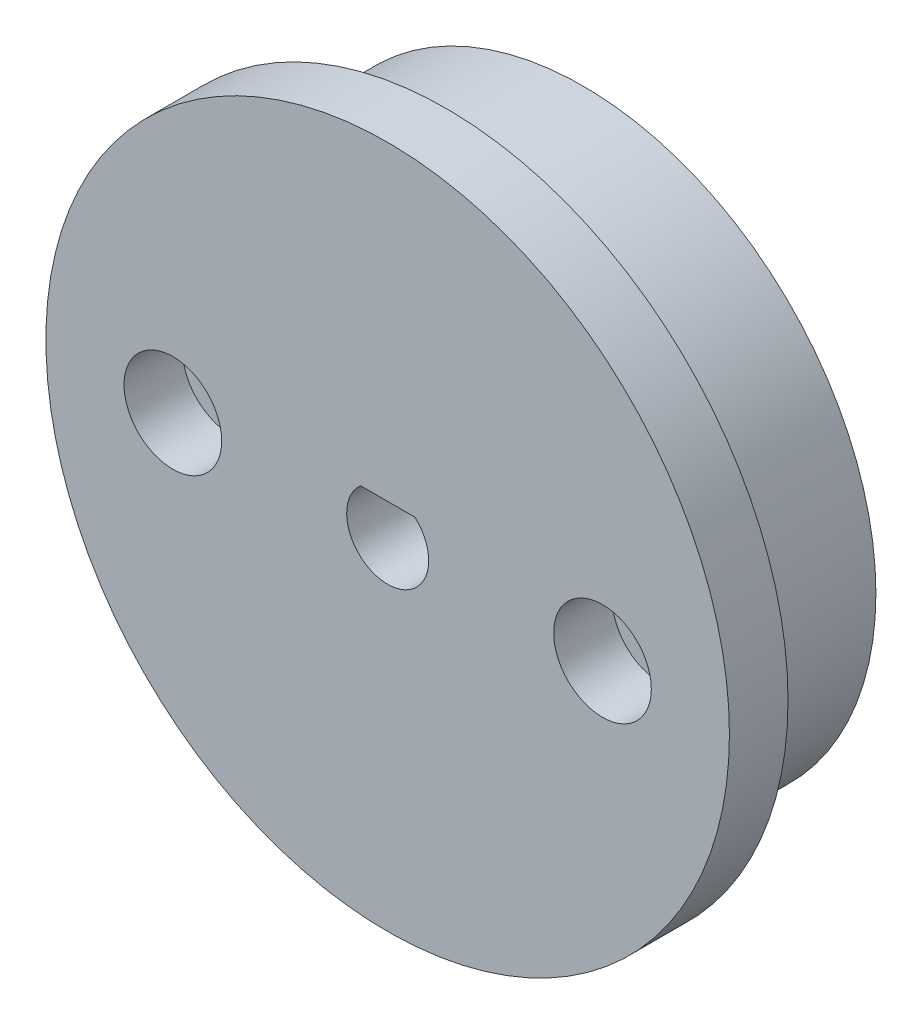
ISO-10303-21;
HEADER;
FILE_DESCRIPTION(('STEP AP214'),'2;1');
FILE_NAME('part.step','',(''),(''),'','','');
FILE_SCHEMA(('AUTOMOTIVE_DESIGN { 1 0 10303 214 1 1 1 1 }'));
ENDSEC;
DATA;
#1=APPLICATION_CONTEXT('core data for automotive mechanical design processes');
#2=APPLICATION_PROTOCOL_DEFINITION('international standard','automotive_design',2000,#1);
#3=PRODUCT_CONTEXT('',#1,'mechanical');
#4=PRODUCT('Part','Part','',(#3));
#5=PRODUCT_RELATED_PRODUCT_CATEGORY('part','',(#4));
#6=PRODUCT_DEFINITION_FORMATION('','',#4);
#7=PRODUCT_DEFINITION_CONTEXT('part definition',#1,'design');
#8=PRODUCT_DEFINITION('design','',#6,#7);
#9=PRODUCT_DEFINITION_SHAPE('','',#8);
#10=(LENGTH_UNIT() NAMED_UNIT(*) SI_UNIT(.MILLI.,.METRE.));
#11=(NAMED_UNIT(*) PLANE_ANGLE_UNIT() SI_UNIT($,.RADIAN.));
#12=(NAMED_UNIT(*) SI_UNIT($,.STERADIAN.) SOLID_ANGLE_UNIT());
#13=UNCERTAINTY_MEASURE_WITH_UNIT(LENGTH_MEASURE(1.E-05),#10,'distance_accuracy_value','');
#14=(GEOMETRIC_REPRESENTATION_CONTEXT(3) GLOBAL_UNCERTAINTY_ASSIGNED_CONTEXT((#13)) GLOBAL_UNIT_ASSIGNED_CONTEXT((#10,
#11,#12)) REPRESENTATION_CONTEXT('',''));
#15=CARTESIAN_POINT('',(0.,0.,0.));
#16=DIRECTION('',(0.,0.,1.));
#17=DIRECTION('',(1.,0.,0.));
#18=AXIS2_PLACEMENT_3D('',#15,#16,#17);
#19=CARTESIAN_POINT('',(11.,0.,0.));
#20=DIRECTION('',(0.,0.,1.));
#21=DIRECTION('',(1.,0.,0.));
#22=AXIS2_PLACEMENT_3D('',#19,#20,#21);
#23=CYLINDRICAL_SURFACE('',#22,1.5);
#24=CARTESIAN_POINT('',(11.,0.,0.));
#25=DIRECTION('',(0.,0.,1.));
#26=DIRECTION('',(1.,0.,0.));
#27=AXIS2_PLACEMENT_3D('',#24,#25,#26);
#28=CIRCLE('',#27,1.5);
#29=CARTESIAN_POINT('',(12.5,0.,0.));
#30=VERTEX_POINT('',#29);
#31=EDGE_CURVE('E98',#30,#30,#28,.T.);
#32=ORIENTED_EDGE('',*,*,#31,.F.);
#33=EDGE_LOOP('',(#32));
#34=FACE_BOUND('',#33,.T.);
#35=CARTESIAN_POINT('',(11.,0.,7.));
#36=DIRECTION('',(0.,0.,1.));
#37=DIRECTION('',(1.,0.,0.));
#38=AXIS2_PLACEMENT_3D('',#35,#36,#37);
#39=CIRCLE('',#38,1.5);
#40=CARTESIAN_POINT('',(12.5,0.,7.));
#41=VERTEX_POINT('',#40);
#42=EDGE_CURVE('E37',#41,#41,#39,.F.);
#43=ORIENTED_EDGE('',*,*,#42,.F.);
#44=EDGE_LOOP('',(#43));
#45=FACE_BOUND('',#44,.T.);
#46=ADVANCED_FACE('F33',(#34,#45),#23,.F.);
#47=CARTESIAN_POINT('',(-11.,0.,0.));
#48=DIRECTION('',(0.,0.,1.));
#49=DIRECTION('',(1.,0.,0.));
#50=AXIS2_PLACEMENT_3D('',#47,#48,#49);
#51=CYLINDRICAL_SURFACE('',#50,1.5);
#52=CARTESIAN_POINT('',(-11.,0.,0.));
#53=DIRECTION('',(0.,0.,1.));
#54=DIRECTION('',(1.,0.,0.));
#55=AXIS2_PLACEMENT_3D('',#52,#53,#54);
#56=CIRCLE('',#55,1.5);
#57=CARTESIAN_POINT('',(-9.5,0.,0.));
#58=VERTEX_POINT('',#57);
#59=EDGE_CURVE('E94',#58,#58,#56,.T.);
#60=ORIENTED_EDGE('',*,*,#59,.F.);
#61=EDGE_LOOP('',(#60));
#62=FACE_BOUND('',#61,.T.);
#63=CARTESIAN_POINT('',(-11.,0.,7.));
#64=DIRECTION('',(0.,0.,1.));
#65=DIRECTION('',(1.,0.,0.));
#66=AXIS2_PLACEMENT_3D('',#63,#64,#65);
#67=CIRCLE('',#66,1.5);
#68=CARTESIAN_POINT('',(-9.5,0.,7.));
#69=VERTEX_POINT('',#68);
#70=EDGE_CURVE('E85',#69,#69,#67,.F.);
#71=ORIENTED_EDGE('',*,*,#70,.F.);
#72=EDGE_LOOP('',(#71));
#73=FACE_BOUND('',#72,.T.);
#74=ADVANCED_FACE('F116',(#62,#73),#51,.F.);
#75=CARTESIAN_POINT('',(0.,0.,7.));
#76=DIRECTION('',(0.,0.,-1.));
#77=DIRECTION('',(-1.,0.,0.));
#78=AXIS2_PLACEMENT_3D('',#75,#76,#77);
#79=CYLINDRICAL_SURFACE('',#78,15.);
#80=CARTESIAN_POINT('',(0.,0.,7.));
#81=DIRECTION('',(0.,0.,1.));
#82=DIRECTION('',(1.,0.,0.));
#83=AXIS2_PLACEMENT_3D('',#80,#81,#82);
#84=CIRCLE('',#83,15.);
#85=CARTESIAN_POINT('',(15.,0.,7.));
#86=VERTEX_POINT('',#85);
#87=EDGE_CURVE('E11',#86,#86,#84,.T.);
#88=ORIENTED_EDGE('',*,*,#87,.F.);
#89=EDGE_LOOP('',(#88));
#90=FACE_BOUND('',#89,.T.);
#91=CARTESIAN_POINT('',(0.,0.,0.));
#92=DIRECTION('',(0.,0.,1.));
#93=DIRECTION('',(1.,0.,0.));
#94=AXIS2_PLACEMENT_3D('',#91,#92,#93);
#95=CIRCLE('',#94,15.);
#96=CARTESIAN_POINT('',(15.,0.,0.));
#97=VERTEX_POINT('',#96);
#98=EDGE_CURVE('E42',#97,#97,#95,.T.);
#99=ORIENTED_EDGE('',*,*,#98,.T.);
#100=EDGE_LOOP('',(#99));
#101=FACE_BOUND('',#100,.T.);
#102=ADVANCED_FACE('F35',(#90,#101),#79,.T.);
#103=CARTESIAN_POINT('',(0.,0.,0.));
#104=DIRECTION('',(0.,0.,1.));
#105=DIRECTION('',(1.,0.,0.));
#106=AXIS2_PLACEMENT_3D('',#103,#104,#105);
#107=PLANE('',#106);
#108=DIRECTION('',(-1.,0.,0.));
#109=VECTOR('',#108,1.);
#110=CARTESIAN_POINT('',(-1.38901943830891,1.575,0.));
#111=LINE('',#110,#109);
#112=CARTESIAN_POINT('',(1.38901943830891,1.575,0.));
#113=VERTEX_POINT('',#112);
#114=CARTESIAN_POINT('',(-1.38901943830891,1.575,0.));
#115=VERTEX_POINT('',#114);
#116=EDGE_CURVE('E78',#113,#115,#111,.T.);
#117=ORIENTED_EDGE('',*,*,#116,.T.);
#118=CARTESIAN_POINT('',(0.,0.,0.));
#119=DIRECTION('',(0.,0.,1.));
#120=DIRECTION('',(1.,0.,0.));
#121=AXIS2_PLACEMENT_3D('',#118,#119,#120);
#122=CIRCLE('',#121,2.1);
#123=EDGE_CURVE('E50',#115,#113,#122,.T.);
#124=ORIENTED_EDGE('',*,*,#123,.T.);
#125=EDGE_LOOP('',(#117,#124));
#126=FACE_BOUND('',#125,.T.);
#127=ORIENTED_EDGE('',*,*,#59,.T.);
#128=EDGE_LOOP('',(#127));
#129=FACE_BOUND('',#128,.T.);
#130=ORIENTED_EDGE('',*,*,#31,.T.);
#131=EDGE_LOOP('',(#130));
#132=FACE_BOUND('',#131,.T.);
#133=ORIENTED_EDGE('',*,*,#98,.F.);
#134=EDGE_LOOP('',(#133));
#135=FACE_BOUND('',#134,.T.);
#136=ADVANCED_FACE('F136',(#126,#129,#132,#135),#107,.F.);
#137=CARTESIAN_POINT('',(0.,0.,10.));
#138=DIRECTION('',(0.,0.,-1.));
#139=DIRECTION('',(-1.,0.,0.));
#140=AXIS2_PLACEMENT_3D('',#137,#138,#139);
#141=CYLINDRICAL_SURFACE('',#140,17.5);
#142=CARTESIAN_POINT('',(0.,0.,10.));
#143=DIRECTION('',(0.,0.,1.));
#144=DIRECTION('',(1.,0.,0.));
#145=AXIS2_PLACEMENT_3D('',#142,#143,#144);
#146=CIRCLE('',#145,17.5);
#147=CARTESIAN_POINT('',(17.5,0.,10.));
#148=VERTEX_POINT('',#147);
#149=EDGE_CURVE('E101',#148,#148,#146,.T.);
#150=ORIENTED_EDGE('',*,*,#149,.F.);
#151=EDGE_LOOP('',(#150));
#152=FACE_BOUND('',#151,.T.);
#153=CARTESIAN_POINT('',(0.,0.,7.));
#154=DIRECTION('',(0.,0.,1.));
#155=DIRECTION('',(1.,0.,0.));
#156=AXIS2_PLACEMENT_3D('',#153,#154,#155);
#157=CIRCLE('',#156,17.5);
#158=CARTESIAN_POINT('',(17.5,0.,7.));
#159=VERTEX_POINT('',#158);
#160=EDGE_CURVE('E97',#159,#159,#157,.T.);
#161=ORIENTED_EDGE('',*,*,#160,.T.);
#162=EDGE_LOOP('',(#161));
#163=FACE_BOUND('',#162,.T.);
#164=ADVANCED_FACE('F130',(#152,#163),#141,.T.);
#165=CARTESIAN_POINT('',(0.,0.,10.));
#166=DIRECTION('',(0.,0.,1.));
#167=DIRECTION('',(1.,0.,0.));
#168=AXIS2_PLACEMENT_3D('',#165,#166,#167);
#169=PLANE('',#168);
#170=CARTESIAN_POINT('',(0.,0.,10.));
#171=DIRECTION('',(0.,0.,1.));
#172=DIRECTION('',(1.,0.,0.));
#173=AXIS2_PLACEMENT_3D('',#170,#171,#172);
#174=CIRCLE('',#173,2.1);
#175=CARTESIAN_POINT('',(-1.38901943830891,1.575,10.));
#176=VERTEX_POINT('',#175);
#177=CARTESIAN_POINT('',(1.38901943830891,1.575,10.));
#178=VERTEX_POINT('',#177);
#179=EDGE_CURVE('E55',#176,#178,#174,.T.);
#180=ORIENTED_EDGE('',*,*,#179,.F.);
#181=DIRECTION('',(-1.,0.,0.));
#182=VECTOR('',#181,1.);
#183=CARTESIAN_POINT('',(-1.38901943830891,1.575,10.));
#184=LINE('',#183,#182);
#185=EDGE_CURVE('E70',#178,#176,#184,.T.);
#186=ORIENTED_EDGE('',*,*,#185,.F.);
#187=EDGE_LOOP('',(#180,#186));
#188=FACE_BOUND('',#187,.T.);
#189=CARTESIAN_POINT('',(11.,0.,10.));
#190=DIRECTION('',(0.,0.,1.));
#191=DIRECTION('',(1.,0.,0.));
#192=AXIS2_PLACEMENT_3D('',#189,#190,#191);
#193=CIRCLE('',#192,2.5);
#194=CARTESIAN_POINT('',(13.5,0.,10.));
#195=VERTEX_POINT('',#194);
#196=EDGE_CURVE('E86',#195,#195,#193,.T.);
#197=ORIENTED_EDGE('',*,*,#196,.F.);
#198=EDGE_LOOP('',(#197));
#199=FACE_BOUND('',#198,.T.);
#200=CARTESIAN_POINT('',(-11.,0.,10.));
#201=DIRECTION('',(0.,0.,1.));
#202=DIRECTION('',(1.,0.,0.));
#203=AXIS2_PLACEMENT_3D('',#200,#201,#202);
#204=CIRCLE('',#203,2.5);
#205=CARTESIAN_POINT('',(-8.5,0.,10.));
#206=VERTEX_POINT('',#205);
#207=EDGE_CURVE('E66',#206,#206,#204,.T.);
#208=ORIENTED_EDGE('',*,*,#207,.F.);
#209=EDGE_LOOP('',(#208));
#210=FACE_BOUND('',#209,.T.);
#211=ORIENTED_EDGE('',*,*,#149,.T.);
#212=EDGE_LOOP('',(#211));
#213=FACE_BOUND('',#212,.T.);
#214=ADVANCED_FACE('F74',(#188,#199,#210,#213),#169,.T.);
#215=CARTESIAN_POINT('',(0.,0.,7.));
#216=DIRECTION('',(0.,0.,1.));
#217=DIRECTION('',(1.,0.,0.));
#218=AXIS2_PLACEMENT_3D('',#215,#216,#217);
#219=PLANE('',#218);
#220=ORIENTED_EDGE('',*,*,#87,.T.);
#221=EDGE_LOOP('',(#220));
#222=FACE_BOUND('',#221,.T.);
#223=ORIENTED_EDGE('',*,*,#160,.F.);
#224=EDGE_LOOP('',(#223));
#225=FACE_BOUND('',#224,.T.);
#226=ADVANCED_FACE('F129',(#222,#225),#219,.F.);
#227=CARTESIAN_POINT('',(-11.,0.,7.));
#228=DIRECTION('',(0.,0.,1.));
#229=DIRECTION('',(1.,0.,0.));
#230=AXIS2_PLACEMENT_3D('',#227,#228,#229);
#231=PLANE('',#230);
#232=CARTESIAN_POINT('',(-11.,0.,7.));
#233=DIRECTION('',(0.,0.,1.));
#234=DIRECTION('',(1.,0.,0.));
#235=AXIS2_PLACEMENT_3D('',#232,#233,#234);
#236=CIRCLE('',#235,2.5);
#237=CARTESIAN_POINT('',(-8.5,0.,7.));
#238=VERTEX_POINT('',#237);
#239=EDGE_CURVE('E89',#238,#238,#236,.T.);
#240=ORIENTED_EDGE('',*,*,#239,.T.);
#241=EDGE_LOOP('',(#240));
#242=FACE_BOUND('',#241,.T.);
#243=ORIENTED_EDGE('',*,*,#70,.T.);
#244=EDGE_LOOP('',(#243));
#245=FACE_BOUND('',#244,.T.);
#246=ADVANCED_FACE('F133',(#242,#245),#231,.T.);
#247=CARTESIAN_POINT('',(-11.,0.,7.));
#248=DIRECTION('',(0.,0.,1.));
#249=DIRECTION('',(1.,0.,0.));
#250=AXIS2_PLACEMENT_3D('',#247,#248,#249);
#251=CYLINDRICAL_SURFACE('',#250,2.5);
#252=ORIENTED_EDGE('',*,*,#239,.F.);
#253=EDGE_LOOP('',(#252));
#254=FACE_BOUND('',#253,.T.);
#255=ORIENTED_EDGE('',*,*,#207,.T.);
#256=EDGE_LOOP('',(#255));
#257=FACE_BOUND('',#256,.T.);
#258=ADVANCED_FACE('F175',(#254,#257),#251,.F.);
#259=CARTESIAN_POINT('',(11.,0.,7.));
#260=DIRECTION('',(0.,0.,1.));
#261=DIRECTION('',(1.,0.,0.));
#262=AXIS2_PLACEMENT_3D('',#259,#260,#261);
#263=PLANE('',#262);
#264=CARTESIAN_POINT('',(11.,0.,7.));
#265=DIRECTION('',(0.,0.,1.));
#266=DIRECTION('',(1.,0.,0.));
#267=AXIS2_PLACEMENT_3D('',#264,#265,#266);
#268=CIRCLE('',#267,2.5);
#269=CARTESIAN_POINT('',(13.5,0.,7.));
#270=VERTEX_POINT('',#269);
#271=EDGE_CURVE('E82',#270,#270,#268,.T.);
#272=ORIENTED_EDGE('',*,*,#271,.T.);
#273=EDGE_LOOP('',(#272));
#274=FACE_BOUND('',#273,.T.);
#275=ORIENTED_EDGE('',*,*,#42,.T.);
#276=EDGE_LOOP('',(#275));
#277=FACE_BOUND('',#276,.T.);
#278=ADVANCED_FACE('F113',(#274,#277),#263,.T.);
#279=CARTESIAN_POINT('',(11.,0.,7.));
#280=DIRECTION('',(0.,0.,1.));
#281=DIRECTION('',(1.,0.,0.));
#282=AXIS2_PLACEMENT_3D('',#279,#280,#281);
#283=CYLINDRICAL_SURFACE('',#282,2.5);
#284=ORIENTED_EDGE('',*,*,#271,.F.);
#285=EDGE_LOOP('',(#284));
#286=FACE_BOUND('',#285,.T.);
#287=ORIENTED_EDGE('',*,*,#196,.T.);
#288=EDGE_LOOP('',(#287));
#289=FACE_BOUND('',#288,.T.);
#290=ADVANCED_FACE('F193',(#286,#289),#283,.F.);
#291=CARTESIAN_POINT('',(0.,0.,0.));
#292=DIRECTION('',(0.,0.,1.));
#293=DIRECTION('',(1.,0.,0.));
#294=AXIS2_PLACEMENT_3D('',#291,#292,#293);
#295=CYLINDRICAL_SURFACE('',#294,2.1);
#296=ORIENTED_EDGE('',*,*,#179,.T.);
#297=DIRECTION('',(0.,0.,1.));
#298=VECTOR('',#297,1.);
#299=CARTESIAN_POINT('',(1.38901943830891,1.575,0.));
#300=LINE('',#299,#298);
#301=EDGE_CURVE('E67',#113,#178,#300,.T.);
#302=ORIENTED_EDGE('',*,*,#301,.F.);
#303=ORIENTED_EDGE('',*,*,#123,.F.);
#304=DIRECTION('',(0.,0.,1.));
#305=VECTOR('',#304,1.);
#306=CARTESIAN_POINT('',(-1.38901943830891,1.575,0.));
#307=LINE('',#306,#305);
#308=EDGE_CURVE('E60',#115,#176,#307,.T.);
#309=ORIENTED_EDGE('',*,*,#308,.T.);
#310=EDGE_LOOP('',(#296,#302,#303,#309));
#311=FACE_BOUND('',#310,.T.);
#312=ADVANCED_FACE('F62',(#311),#295,.F.);
#313=CARTESIAN_POINT('',(-1.38901943830891,1.575,0.));
#314=DIRECTION('',(0.,1.,0.));
#315=DIRECTION('',(0.,0.,1.));
#316=AXIS2_PLACEMENT_3D('',#313,#314,#315);
#317=PLANE('',#316);
#318=ORIENTED_EDGE('',*,*,#185,.T.);
#319=ORIENTED_EDGE('',*,*,#308,.F.);
#320=ORIENTED_EDGE('',*,*,#116,.F.);
#321=ORIENTED_EDGE('',*,*,#301,.T.);
#322=EDGE_LOOP('',(#318,#319,#320,#321));
#323=FACE_BOUND('',#322,.T.);
#324=ADVANCED_FACE('F71',(#323),#317,.F.);
#325=CLOSED_SHELL('',(#46,#74,#102,#136,#164,#214,#226,#246,#258,#278,#290,#312,#324));
#326=MANIFOLD_SOLID_BREP('B2',#325);
#327=ADVANCED_BREP_SHAPE_REPRESENTATION('',(#18,#326),#14);
#328=SHAPE_DEFINITION_REPRESENTATION(#9,#327);
ENDSEC;
END-ISO-10303-21;
